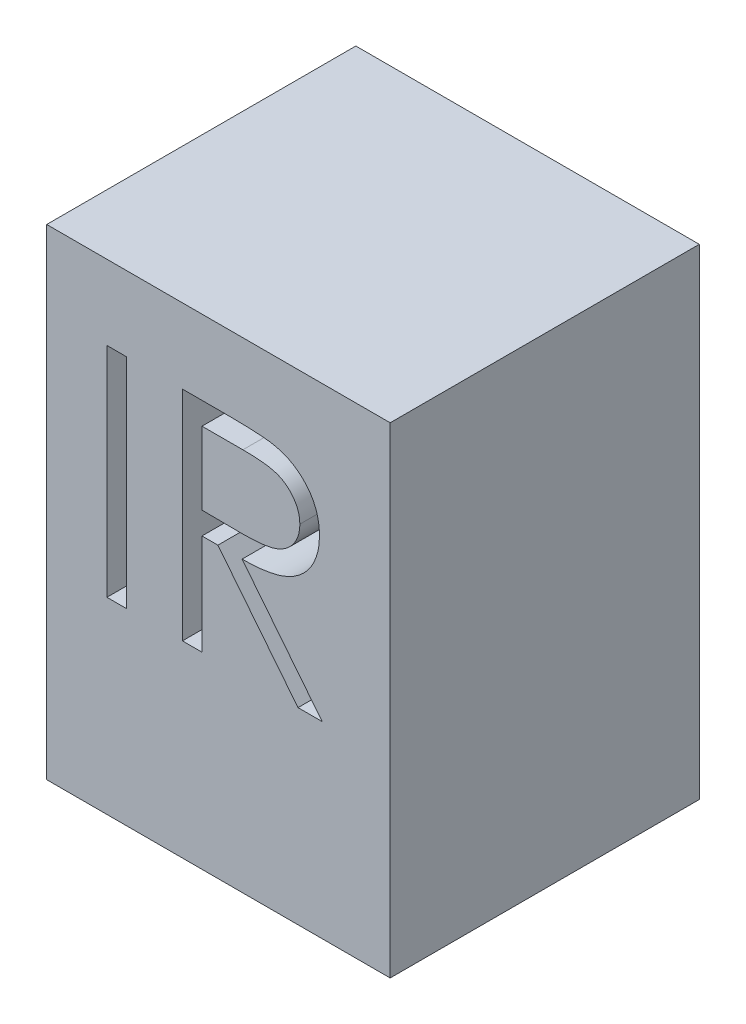
ISO-10303-21;
HEADER;
FILE_DESCRIPTION(('STEP AP214'),'2;1');
FILE_NAME('part.step','',(''),(''),'','','');
FILE_SCHEMA(('AUTOMOTIVE_DESIGN { 1 0 10303 214 1 1 1 1 }'));
ENDSEC;
DATA;
#1=APPLICATION_CONTEXT('core data for automotive mechanical design processes');
#2=APPLICATION_PROTOCOL_DEFINITION('international standard','automotive_design',2000,#1);
#3=PRODUCT_CONTEXT('',#1,'mechanical');
#4=PRODUCT('Part','Part','',(#3));
#5=PRODUCT_RELATED_PRODUCT_CATEGORY('part','',(#4));
#6=PRODUCT_DEFINITION_FORMATION('','',#4);
#7=PRODUCT_DEFINITION_CONTEXT('part definition',#1,'design');
#8=PRODUCT_DEFINITION('design','',#6,#7);
#9=PRODUCT_DEFINITION_SHAPE('','',#8);
#10=(LENGTH_UNIT() NAMED_UNIT(*) SI_UNIT(.MILLI.,.METRE.));
#11=(NAMED_UNIT(*) PLANE_ANGLE_UNIT() SI_UNIT($,.RADIAN.));
#12=(NAMED_UNIT(*) SI_UNIT($,.STERADIAN.) SOLID_ANGLE_UNIT());
#13=UNCERTAINTY_MEASURE_WITH_UNIT(LENGTH_MEASURE(1.E-05),#10,'distance_accuracy_value','');
#14=(GEOMETRIC_REPRESENTATION_CONTEXT(3) GLOBAL_UNCERTAINTY_ASSIGNED_CONTEXT((#13)) GLOBAL_UNIT_ASSIGNED_CONTEXT((#10,
#11,#12)) REPRESENTATION_CONTEXT('',''));
#15=CARTESIAN_POINT('',(0.,0.,0.));
#16=DIRECTION('',(0.,0.,1.));
#17=DIRECTION('',(1.,0.,0.));
#18=AXIS2_PLACEMENT_3D('',#15,#16,#17);
#19=CARTESIAN_POINT('',(0.,0.,4.5));
#20=DIRECTION('',(0.,0.,-1.));
#21=DIRECTION('',(-1.,0.,0.));
#22=AXIS2_PLACEMENT_3D('',#19,#20,#21);
#23=PLANE('',#22);
#24=DIRECTION('',(0.,1.,0.));
#25=VECTOR('',#24,1.);
#26=CARTESIAN_POINT('',(1.97557816004579,2.73785841834464,4.5));
#27=LINE('',#26,#25);
#28=CARTESIAN_POINT('',(1.97557816004579,2.73785841834464,4.5));
#29=VERTEX_POINT('',#28);
#30=CARTESIAN_POINT('',(1.97557816004579,5.91285841834464,4.5));
#31=VERTEX_POINT('',#30);
#32=EDGE_CURVE('E60',#29,#31,#27,.T.);
#33=ORIENTED_EDGE('',*,*,#32,.T.);
#34=DIRECTION('',(1.,0.,0.));
#35=VECTOR('',#34,1.);
#36=CARTESIAN_POINT('',(1.97557816004579,5.91285841834464,4.5));
#37=LINE('',#36,#35);
#38=CARTESIAN_POINT('',(2.61095977062271,5.91285841834464,4.5));
#39=VERTEX_POINT('',#38);
#40=EDGE_CURVE('E293',#31,#39,#37,.T.);
#41=ORIENTED_EDGE('',*,*,#40,.T.);
#42=CARTESIAN_POINT('',(2.61095977062271,5.91285841834464,4.5));
#43=CARTESIAN_POINT('',(2.6533606514886,5.91271727962692,4.5));
#44=CARTESIAN_POINT('',(2.73477503963111,5.91244627765452,4.5));
#45=CARTESIAN_POINT('',(2.85140936345735,5.91093519273071,4.5));
#46=CARTESIAN_POINT('',(2.95738823002181,5.90660417005252,4.5));
#47=CARTESIAN_POINT('',(3.05265622711664,5.90287709789828,4.5));
#48=CARTESIAN_POINT('',(3.13721160698801,5.89608083684085,4.5));
#49=CARTESIAN_POINT('',(3.21131364930936,5.8895851069536,4.5));
#50=CARTESIAN_POINT('',(3.27462106061403,5.8810818575327,4.5));
#51=CARTESIAN_POINT('',(3.31294408286709,5.87318479527102,4.5));
#52=CARTESIAN_POINT('',(3.33029570812271,5.86960921962669,4.5));
#53=B_SPLINE_CURVE_WITH_KNOTS('',3,(#42,#43,#44,#45,#46,#47,#48,#49,#50,#51,#52),.UNSPECIFIED.,
.F.,.F.,(4,1,1,1,1,1,1,1,4),(0.,0.1762577548178,0.338434413880475,0.484822050787836,
0.617157578266332,0.734698360612476,0.83738518383236,0.926372420929584,1.),.UNSPECIFIED.);
#54=CARTESIAN_POINT('',(3.33029570812271,5.86960921962669,4.5));
#55=VERTEX_POINT('',#54);
#56=EDGE_CURVE('E285',#39,#55,#53,.T.);
#57=ORIENTED_EDGE('',*,*,#56,.T.);
#58=CARTESIAN_POINT('',(3.33029570812271,5.86960921962669,4.5));
#59=CARTESIAN_POINT('',(3.35352457430399,5.8638699396165,4.5));
#60=CARTESIAN_POINT('',(3.39948677189621,5.85251381401798,4.5));
#61=CARTESIAN_POINT('',(3.4656629032324,5.82851117612796,4.5));
#62=CARTESIAN_POINT('',(3.52872232567433,5.80073480236127,4.5));
#63=CARTESIAN_POINT('',(3.58840309488046,5.76811057035844,4.5));
#64=CARTESIAN_POINT('',(3.64440627688891,5.73039630594122,4.5));
#65=CARTESIAN_POINT('',(3.69730931596693,5.68824308058933,4.5));
#66=CARTESIAN_POINT('',(3.74735227203305,5.64188154392612,4.5));
#67=CARTESIAN_POINT('',(3.79251132226808,5.5901427948487,4.5));
#68=CARTESIAN_POINT('',(3.83509174773386,5.53586253249614,4.5));
#69=CARTESIAN_POINT('',(3.87100428748795,5.47716698164735,4.5));
#70=CARTESIAN_POINT('',(3.90196187980764,5.41578831025056,4.5));
#71=CARTESIAN_POINT('',(3.9266094202292,5.35110229557238,4.5));
#72=CARTESIAN_POINT('',(3.94645586759413,5.28373625966843,4.5));
#73=CARTESIAN_POINT('',(3.96044967045207,5.2130799940659,4.5));
#74=CARTESIAN_POINT('',(3.96884181923144,5.13945539523978,4.5));
#75=CARTESIAN_POINT('',(3.96969621676928,5.0892378636931,4.5));
#76=CARTESIAN_POINT('',(3.97012944209707,5.06377488469079,4.5));
#77=B_SPLINE_CURVE_WITH_KNOTS('',3,(#58,#59,#60,#61,#62,#63,#64,#65,#66,#67,#68,#69,#70,#71,#72,
#73,#74,#75,#76),.UNSPECIFIED.,.F.,.F.,(4,1,1,1,1,1,1,1,1,1,1,1,1,1,1,1,4),(0.,
0.0642168426314305,0.127063765693129,0.188744538347829,0.249132102835041,0.309452532710628,
0.369826676247682,0.430650141838469,0.492351931879469,0.554072106262517,0.615689783744975,
0.676797702506538,0.738439048246941,0.801316910064893,0.865184511711541,0.931641324419075,1.),.UNSPECIFIED.);
#78=CARTESIAN_POINT('',(3.97012944209707,5.06377488469079,4.5));
#79=VERTEX_POINT('',#78);
#80=EDGE_CURVE('E277',#55,#79,#77,.T.);
#81=ORIENTED_EDGE('',*,*,#80,.T.);
#82=CARTESIAN_POINT('',(3.97012944209707,5.06377488469079,4.5));
#83=CARTESIAN_POINT('',(3.96879685095579,5.02147018265087,4.5));
#84=CARTESIAN_POINT('',(3.96619662048947,4.93892275178098,4.5));
#85=CARTESIAN_POINT('',(3.94195313357975,4.81912466650302,4.5));
#86=CARTESIAN_POINT('',(3.90224157639723,4.70737435965062,4.5));
#87=CARTESIAN_POINT('',(3.84751973565307,4.60381253811302,4.5));
#88=CARTESIAN_POINT('',(3.77783349697012,4.51045788125062,4.5));
#89=CARTESIAN_POINT('',(3.6940817221835,4.42846082536781,4.5));
#90=CARTESIAN_POINT('',(3.59621768890359,4.35984461894614,4.5));
#91=CARTESIAN_POINT('',(3.50511395230162,4.31226243182406,4.5));
#92=CARTESIAN_POINT('',(3.42463749971967,4.28178886471447,4.5));
#93=CARTESIAN_POINT('',(3.35838585169053,4.26034731060662,4.5));
#94=CARTESIAN_POINT('',(3.28611652210503,4.24378109924813,4.5));
#95=CARTESIAN_POINT('',(3.20852193999827,4.22894012257053,4.5));
#96=CARTESIAN_POINT('',(3.12527919537329,4.2177353712115,4.5));
#97=CARTESIAN_POINT('',(3.0365878024988,4.20952881765716,4.5));
#98=CARTESIAN_POINT('',(2.94238450780579,4.20439978776657,4.5));
#99=CARTESIAN_POINT('',(2.87766978060687,4.20363596904589,4.5));
#100=CARTESIAN_POINT('',(2.844378240174,4.20324303372926,4.5));
#101=B_SPLINE_CURVE_WITH_KNOTS('',3,(#82,#83,#84,#85,#86,#87,#88,#89,#90,#91,#92,#93,#94,#95,
#96,#97,#98,#99,#100),.UNSPECIFIED.,.F.,.F.,(4,1,1,1,1,1,1,1,1,1,1,1,1,1,1,1,4),(0.,
0.0787802355821392,0.153720644208585,0.226713530308781,0.299191166065937,0.371189996837669,
0.44300641435341,0.516689173294881,0.593217216623413,0.633872917807846,0.676989142289979,
0.722899506325827,0.771958610506144,0.824211323334836,0.879378650627202,0.937948119330418,1.),.UNSPECIFIED.);
#102=CARTESIAN_POINT('',(2.844378240174,4.20324303372926,4.5));
#103=VERTEX_POINT('',#102);
#104=EDGE_CURVE('E272',#79,#103,#101,.T.);
#105=ORIENTED_EDGE('',*,*,#104,.T.);
#106=DIRECTION('',(0.622788232243938,-0.782390450976027,0.));
#107=VECTOR('',#106,1.);
#108=CARTESIAN_POINT('',(2.844378240174,4.20324303372926,4.5));
#109=LINE('',#108,#107);
#110=CARTESIAN_POINT('',(4.0108345703022,2.73785841834464,4.5));
#111=VERTEX_POINT('',#110);
#112=EDGE_CURVE('E269',#103,#111,#109,.T.);
#113=ORIENTED_EDGE('',*,*,#112,.T.);
#114=DIRECTION('',(-1.,0.,0.));
#115=VECTOR('',#114,1.);
#116=CARTESIAN_POINT('',(4.0108345703022,2.73785841834464,4.5));
#117=LINE('',#116,#115);
#118=CARTESIAN_POINT('',(3.65848080427656,2.73785841834464,4.5));
#119=VERTEX_POINT('',#118);
#120=EDGE_CURVE('E266',#111,#119,#117,.T.);
#121=ORIENTED_EDGE('',*,*,#120,.T.);
#122=DIRECTION('',(-0.622788232243938,0.782390450976027,0.));
#123=VECTOR('',#122,1.);
#124=CARTESIAN_POINT('',(3.65848080427656,2.73785841834464,4.5));
#125=LINE('',#124,#123);
#126=CARTESIAN_POINT('',(2.49202447414836,4.20324303372926,4.5));
#127=VERTEX_POINT('',#126);
#128=EDGE_CURVE('E263',#119,#127,#125,.T.);
#129=ORIENTED_EDGE('',*,*,#128,.T.);
#130=DIRECTION('',(-1.,0.,0.));
#131=VECTOR('',#130,1.);
#132=CARTESIAN_POINT('',(2.49202447414836,4.20324303372926,4.5));
#133=LINE('',#132,#131);
#134=CARTESIAN_POINT('',(2.26051405748169,4.20324303372926,4.5));
#135=VERTEX_POINT('',#134);
#136=EDGE_CURVE('E260',#127,#135,#133,.T.);
#137=ORIENTED_EDGE('',*,*,#136,.T.);
#138=DIRECTION('',(0.,-1.,0.));
#139=VECTOR('',#138,1.);
#140=CARTESIAN_POINT('',(2.26051405748169,4.20324303372926,4.5));
#141=LINE('',#140,#139);
#142=CARTESIAN_POINT('',(2.26051405748169,2.73785841834464,4.5));
#143=VERTEX_POINT('',#142);
#144=EDGE_CURVE('E256',#135,#143,#141,.T.);
#145=ORIENTED_EDGE('',*,*,#144,.T.);
#146=DIRECTION('',(-1.,0.,0.));
#147=VECTOR('',#146,1.);
#148=CARTESIAN_POINT('',(2.26051405748169,2.73785841834464,4.5));
#149=LINE('',#148,#147);
#150=EDGE_CURVE('E253',#143,#29,#149,.T.);
#151=ORIENTED_EDGE('',*,*,#150,.T.);
#152=EDGE_LOOP('',(#33,#41,#57,#81,#105,#113,#121,#129,#137,#145,#151));
#153=FACE_BOUND('',#152,.T.);
#154=DIRECTION('',(0.,-1.,0.));
#155=VECTOR('',#154,1.);
#156=CARTESIAN_POINT('',(0.,0.,4.5));
#157=LINE('',#156,#155);
#158=CARTESIAN_POINT('',(0.,7.,4.5));
#159=VERTEX_POINT('',#158);
#160=CARTESIAN_POINT('',(0.,0.,4.5));
#161=VERTEX_POINT('',#160);
#162=EDGE_CURVE('E405',#159,#161,#157,.T.);
#163=ORIENTED_EDGE('',*,*,#162,.T.);
#164=DIRECTION('',(1.,0.,0.));
#165=VECTOR('',#164,1.);
#166=CARTESIAN_POINT('',(0.,0.,4.5));
#167=LINE('',#166,#165);
#168=CARTESIAN_POINT('',(5.,0.,4.5));
#169=VERTEX_POINT('',#168);
#170=EDGE_CURVE('E408',#161,#169,#167,.T.);
#171=ORIENTED_EDGE('',*,*,#170,.T.);
#172=DIRECTION('',(0.,1.,0.));
#173=VECTOR('',#172,1.);
#174=CARTESIAN_POINT('',(5.,0.,4.5));
#175=LINE('',#174,#173);
#176=CARTESIAN_POINT('',(5.,7.,4.5));
#177=VERTEX_POINT('',#176);
#178=EDGE_CURVE('E411',#169,#177,#175,.T.);
#179=ORIENTED_EDGE('',*,*,#178,.T.);
#180=DIRECTION('',(-1.,0.,0.));
#181=VECTOR('',#180,1.);
#182=CARTESIAN_POINT('',(0.,7.,4.5));
#183=LINE('',#182,#181);
#184=EDGE_CURVE('E413',#177,#159,#183,.T.);
#185=ORIENTED_EDGE('',*,*,#184,.T.);
#186=EDGE_LOOP('',(#163,#171,#179,#185));
#187=FACE_BOUND('',#186,.T.);
#188=DIRECTION('',(0.,1.,0.));
#189=VECTOR('',#188,1.);
#190=CARTESIAN_POINT('',(0.876539698507329,2.73785841834464,4.5));
#191=LINE('',#190,#189);
#192=CARTESIAN_POINT('',(0.876539698507329,2.73785841834464,4.5));
#193=VERTEX_POINT('',#192);
#194=CARTESIAN_POINT('',(0.876539698507329,5.91285841834464,4.5));
#195=VERTEX_POINT('',#194);
#196=EDGE_CURVE('E52',#193,#195,#191,.T.);
#197=ORIENTED_EDGE('',*,*,#196,.T.);
#198=DIRECTION('',(1.,0.,0.));
#199=VECTOR('',#198,1.);
#200=CARTESIAN_POINT('',(0.876539698507329,5.91285841834464,4.5));
#201=LINE('',#200,#199);
#202=CARTESIAN_POINT('',(1.16147559594323,5.91285841834464,4.5));
#203=VERTEX_POINT('',#202);
#204=EDGE_CURVE('E219',#195,#203,#201,.T.);
#205=ORIENTED_EDGE('',*,*,#204,.T.);
#206=DIRECTION('',(0.,-1.,0.));
#207=VECTOR('',#206,1.);
#208=CARTESIAN_POINT('',(1.16147559594323,5.91285841834464,4.5));
#209=LINE('',#208,#207);
#210=CARTESIAN_POINT('',(1.16147559594323,2.73785841834464,4.5));
#211=VERTEX_POINT('',#210);
#212=EDGE_CURVE('E540',#203,#211,#209,.T.);
#213=ORIENTED_EDGE('',*,*,#212,.T.);
#214=DIRECTION('',(-1.,0.,0.));
#215=VECTOR('',#214,1.);
#216=CARTESIAN_POINT('',(1.16147559594323,2.73785841834464,4.5));
#217=LINE('',#216,#215);
#218=EDGE_CURVE('E215',#211,#193,#217,.T.);
#219=ORIENTED_EDGE('',*,*,#218,.T.);
#220=EDGE_LOOP('',(#197,#205,#213,#219));
#221=FACE_BOUND('',#220,.T.);
#222=ADVANCED_FACE('F37',(#153,#187,#221),#23,.F.);
#223=CARTESIAN_POINT('',(0.,0.,4.5));
#224=DIRECTION('',(1.,0.,0.));
#225=DIRECTION('',(0.,0.,-1.));
#226=AXIS2_PLACEMENT_3D('',#223,#224,#225);
#227=PLANE('',#226);
#228=DIRECTION('',(0.,-1.,0.));
#229=VECTOR('',#228,1.);
#230=CARTESIAN_POINT('',(0.,0.,0.));
#231=LINE('',#230,#229);
#232=CARTESIAN_POINT('',(0.,7.,0.));
#233=VERTEX_POINT('',#232);
#234=CARTESIAN_POINT('',(0.,0.,0.));
#235=VERTEX_POINT('',#234);
#236=EDGE_CURVE('E220',#233,#235,#231,.T.);
#237=ORIENTED_EDGE('',*,*,#236,.T.);
#238=DIRECTION('',(0.,0.,-1.));
#239=VECTOR('',#238,1.);
#240=CARTESIAN_POINT('',(0.,0.,4.5));
#241=LINE('',#240,#239);
#242=EDGE_CURVE('E11',#161,#235,#241,.T.);
#243=ORIENTED_EDGE('',*,*,#242,.F.);
#244=ORIENTED_EDGE('',*,*,#162,.F.);
#245=DIRECTION('',(0.,0.,-1.));
#246=VECTOR('',#245,1.);
#247=CARTESIAN_POINT('',(0.,7.,4.5));
#248=LINE('',#247,#246);
#249=EDGE_CURVE('E414',#159,#233,#248,.T.);
#250=ORIENTED_EDGE('',*,*,#249,.T.);
#251=EDGE_LOOP('',(#237,#243,#244,#250));
#252=FACE_BOUND('',#251,.T.);
#253=ADVANCED_FACE('F39',(#252),#227,.F.);
#254=CARTESIAN_POINT('',(0.,0.,4.5));
#255=DIRECTION('',(0.,1.,0.));
#256=DIRECTION('',(0.,0.,1.));
#257=AXIS2_PLACEMENT_3D('',#254,#255,#256);
#258=PLANE('',#257);
#259=DIRECTION('',(1.,0.,0.));
#260=VECTOR('',#259,1.);
#261=CARTESIAN_POINT('',(0.,0.,0.));
#262=LINE('',#261,#260);
#263=CARTESIAN_POINT('',(5.,0.,0.));
#264=VERTEX_POINT('',#263);
#265=EDGE_CURVE('E224',#235,#264,#262,.T.);
#266=ORIENTED_EDGE('',*,*,#265,.T.);
#267=DIRECTION('',(0.,0.,-1.));
#268=VECTOR('',#267,1.);
#269=CARTESIAN_POINT('',(5.,0.,4.5));
#270=LINE('',#269,#268);
#271=EDGE_CURVE('E45',#169,#264,#270,.T.);
#272=ORIENTED_EDGE('',*,*,#271,.F.);
#273=ORIENTED_EDGE('',*,*,#170,.F.);
#274=ORIENTED_EDGE('',*,*,#242,.T.);
#275=EDGE_LOOP('',(#266,#272,#273,#274));
#276=FACE_BOUND('',#275,.T.);
#277=ADVANCED_FACE('F445',(#276),#258,.F.);
#278=CARTESIAN_POINT('',(5.,0.,4.5));
#279=DIRECTION('',(-1.,0.,0.));
#280=DIRECTION('',(0.,-1.,0.));
#281=AXIS2_PLACEMENT_3D('',#278,#279,#280);
#282=PLANE('',#281);
#283=DIRECTION('',(0.,1.,0.));
#284=VECTOR('',#283,1.);
#285=CARTESIAN_POINT('',(5.,0.,0.));
#286=LINE('',#285,#284);
#287=CARTESIAN_POINT('',(5.,7.,0.));
#288=VERTEX_POINT('',#287);
#289=EDGE_CURVE('E417',#264,#288,#286,.T.);
#290=ORIENTED_EDGE('',*,*,#289,.T.);
#291=DIRECTION('',(0.,0.,-1.));
#292=VECTOR('',#291,1.);
#293=CARTESIAN_POINT('',(5.,7.,4.5));
#294=LINE('',#293,#292);
#295=EDGE_CURVE('E422',#177,#288,#294,.T.);
#296=ORIENTED_EDGE('',*,*,#295,.F.);
#297=ORIENTED_EDGE('',*,*,#178,.F.);
#298=ORIENTED_EDGE('',*,*,#271,.T.);
#299=EDGE_LOOP('',(#290,#296,#297,#298));
#300=FACE_BOUND('',#299,.T.);
#301=ADVANCED_FACE('F429',(#300),#282,.F.);
#302=CARTESIAN_POINT('',(0.,7.,4.5));
#303=DIRECTION('',(0.,-1.,0.));
#304=DIRECTION('',(0.,0.,-1.));
#305=AXIS2_PLACEMENT_3D('',#302,#303,#304);
#306=PLANE('',#305);
#307=DIRECTION('',(-1.,0.,0.));
#308=VECTOR('',#307,1.);
#309=CARTESIAN_POINT('',(0.,7.,0.));
#310=LINE('',#309,#308);
#311=EDGE_CURVE('E409',#288,#233,#310,.T.);
#312=ORIENTED_EDGE('',*,*,#311,.T.);
#313=ORIENTED_EDGE('',*,*,#249,.F.);
#314=ORIENTED_EDGE('',*,*,#184,.F.);
#315=ORIENTED_EDGE('',*,*,#295,.T.);
#316=EDGE_LOOP('',(#312,#313,#314,#315));
#317=FACE_BOUND('',#316,.T.);
#318=ADVANCED_FACE('F438',(#317),#306,.F.);
#319=CARTESIAN_POINT('',(0.,0.,0.));
#320=DIRECTION('',(0.,0.,-1.));
#321=DIRECTION('',(-1.,0.,0.));
#322=AXIS2_PLACEMENT_3D('',#319,#320,#321);
#323=PLANE('',#322);
#324=ORIENTED_EDGE('',*,*,#236,.F.);
#325=ORIENTED_EDGE('',*,*,#311,.F.);
#326=ORIENTED_EDGE('',*,*,#289,.F.);
#327=ORIENTED_EDGE('',*,*,#265,.F.);
#328=EDGE_LOOP('',(#324,#325,#326,#327));
#329=FACE_BOUND('',#328,.T.);
#330=ADVANCED_FACE('F435',(#329),#323,.T.);
#331=CARTESIAN_POINT('',(1.97557816004579,2.73785841834464,3.23));
#332=DIRECTION('',(1.,0.,0.));
#333=DIRECTION('',(0.,0.,-1.));
#334=AXIS2_PLACEMENT_3D('',#331,#332,#333);
#335=PLANE('',#334);
#336=ORIENTED_EDGE('',*,*,#32,.F.);
#337=DIRECTION('',(0.,0.,1.));
#338=VECTOR('',#337,1.);
#339=CARTESIAN_POINT('',(1.97557816004579,2.73785841834464,3.23));
#340=LINE('',#339,#338);
#341=CARTESIAN_POINT('',(1.97557816004579,2.73785841834464,3.23));
#342=VERTEX_POINT('',#341);
#343=EDGE_CURVE('E250',#342,#29,#340,.T.);
#344=ORIENTED_EDGE('',*,*,#343,.F.);
#345=DIRECTION('',(0.,1.,0.));
#346=VECTOR('',#345,1.);
#347=CARTESIAN_POINT('',(1.97557816004579,2.73785841834464,3.23));
#348=LINE('',#347,#346);
#349=CARTESIAN_POINT('',(1.97557816004579,5.91285841834464,3.23));
#350=VERTEX_POINT('',#349);
#351=EDGE_CURVE('E257',#342,#350,#348,.T.);
#352=ORIENTED_EDGE('',*,*,#351,.T.);
#353=DIRECTION('',(0.,0.,1.));
#354=VECTOR('',#353,1.);
#355=CARTESIAN_POINT('',(1.97557816004579,5.91285841834464,3.23));
#356=LINE('',#355,#354);
#357=EDGE_CURVE('E230',#350,#31,#356,.T.);
#358=ORIENTED_EDGE('',*,*,#357,.T.);
#359=EDGE_LOOP('',(#336,#344,#352,#358));
#360=FACE_BOUND('',#359,.T.);
#361=ADVANCED_FACE('F520',(#360),#335,.T.);
#362=CARTESIAN_POINT('',(1.97557816004579,5.91285841834464,3.23));
#363=DIRECTION('',(0.,-1.,0.));
#364=DIRECTION('',(0.,0.,-1.));
#365=AXIS2_PLACEMENT_3D('',#362,#363,#364);
#366=PLANE('',#365);
#367=ORIENTED_EDGE('',*,*,#40,.F.);
#368=ORIENTED_EDGE('',*,*,#357,.F.);
#369=DIRECTION('',(1.,0.,0.));
#370=VECTOR('',#369,1.);
#371=CARTESIAN_POINT('',(1.97557816004579,5.91285841834464,3.23));
#372=LINE('',#371,#370);
#373=CARTESIAN_POINT('',(2.61095977062271,5.91285841834464,3.23));
#374=VERTEX_POINT('',#373);
#375=EDGE_CURVE('E505',#350,#374,#372,.T.);
#376=ORIENTED_EDGE('',*,*,#375,.T.);
#377=DIRECTION('',(0.,0.,1.));
#378=VECTOR('',#377,1.);
#379=CARTESIAN_POINT('',(2.61095977062271,5.91285841834464,3.23));
#380=LINE('',#379,#378);
#381=EDGE_CURVE('E232',#374,#39,#380,.T.);
#382=ORIENTED_EDGE('',*,*,#381,.T.);
#383=EDGE_LOOP('',(#367,#368,#376,#382));
#384=FACE_BOUND('',#383,.T.);
#385=ADVANCED_FACE('F516',(#384),#366,.T.);
#386=CARTESIAN_POINT('',(2.61095977062271,5.91285841834464,3.23));
#387=CARTESIAN_POINT('',(2.6533606514886,5.91271727962692,3.23));
#388=CARTESIAN_POINT('',(2.73477503963111,5.91244627765452,3.23));
#389=CARTESIAN_POINT('',(2.85140936345735,5.91093519273071,3.23));
#390=CARTESIAN_POINT('',(2.95738823002181,5.90660417005252,3.23));
#391=CARTESIAN_POINT('',(3.05265622711664,5.90287709789828,3.23));
#392=CARTESIAN_POINT('',(3.13721160698801,5.89608083684085,3.23));
#393=CARTESIAN_POINT('',(3.21131364930936,5.8895851069536,3.23));
#394=CARTESIAN_POINT('',(3.27462106061403,5.8810818575327,3.23));
#395=CARTESIAN_POINT('',(3.31294408286709,5.87318479527102,3.23));
#396=CARTESIAN_POINT('',(3.33029570812271,5.86960921962669,3.23));
#397=B_SPLINE_CURVE_WITH_KNOTS('',3,(#386,#387,#388,#389,#390,#391,#392,#393,#394,#395,#396),
.UNSPECIFIED.,.F.,.F.,(4,1,1,1,1,1,1,1,4),(0.,0.1762577548178,0.338434413880475,
0.484822050787836,0.617157578266332,0.734698360612476,0.83738518383236,0.926372420929584,1.),.UNSPECIFIED.);
#398=DIRECTION('',(0.,0.,1.));
#399=VECTOR('',#398,1.);
#400=SURFACE_OF_LINEAR_EXTRUSION('',#397,#399);
#401=ORIENTED_EDGE('',*,*,#56,.F.);
#402=ORIENTED_EDGE('',*,*,#381,.F.);
#403=CARTESIAN_POINT('',(3.33029570812271,5.86960921962669,3.23));
#404=VERTEX_POINT('',#403);
#405=EDGE_CURVE('E506',#374,#404,#397,.T.);
#406=ORIENTED_EDGE('',*,*,#405,.T.);
#407=DIRECTION('',(0.,0.,1.));
#408=VECTOR('',#407,1.);
#409=CARTESIAN_POINT('',(3.33029570812271,5.86960921962669,3.23));
#410=LINE('',#409,#408);
#411=EDGE_CURVE('E234',#404,#55,#410,.T.);
#412=ORIENTED_EDGE('',*,*,#411,.T.);
#413=EDGE_LOOP('',(#401,#402,#406,#412));
#414=FACE_BOUND('',#413,.T.);
#415=ADVANCED_FACE('F513',(#414),#400,.T.);
#416=CARTESIAN_POINT('',(3.33029570812271,5.86960921962669,3.23));
#417=CARTESIAN_POINT('',(3.35352457430399,5.8638699396165,3.23));
#418=CARTESIAN_POINT('',(3.39948677189621,5.85251381401798,3.23));
#419=CARTESIAN_POINT('',(3.4656629032324,5.82851117612796,3.23));
#420=CARTESIAN_POINT('',(3.52872232567433,5.80073480236127,3.23));
#421=CARTESIAN_POINT('',(3.58840309488046,5.76811057035844,3.23));
#422=CARTESIAN_POINT('',(3.64440627688891,5.73039630594122,3.23));
#423=CARTESIAN_POINT('',(3.69730931596693,5.68824308058933,3.23));
#424=CARTESIAN_POINT('',(3.74735227203305,5.64188154392612,3.23));
#425=CARTESIAN_POINT('',(3.79251132226808,5.5901427948487,3.23));
#426=CARTESIAN_POINT('',(3.83509174773386,5.53586253249614,3.23));
#427=CARTESIAN_POINT('',(3.87100428748795,5.47716698164735,3.23));
#428=CARTESIAN_POINT('',(3.90196187980764,5.41578831025056,3.23));
#429=CARTESIAN_POINT('',(3.9266094202292,5.35110229557238,3.23));
#430=CARTESIAN_POINT('',(3.94645586759413,5.28373625966843,3.23));
#431=CARTESIAN_POINT('',(3.96044967045207,5.2130799940659,3.23));
#432=CARTESIAN_POINT('',(3.96884181923144,5.13945539523978,3.23));
#433=CARTESIAN_POINT('',(3.96969621676928,5.0892378636931,3.23));
#434=CARTESIAN_POINT('',(3.97012944209707,5.06377488469079,3.23));
#435=B_SPLINE_CURVE_WITH_KNOTS('',3,(#416,#417,#418,#419,#420,#421,#422,#423,#424,#425,#426,
#427,#428,#429,#430,#431,#432,#433,#434),.UNSPECIFIED.,.F.,.F.,(4,1,1,1,1,1,1,1,1,1,1,1,1,1,1,1,
4),(0.,0.0642168426314305,0.127063765693129,0.188744538347829,0.249132102835041,
0.309452532710628,0.369826676247682,0.430650141838469,0.492351931879469,0.554072106262517,
0.615689783744975,0.676797702506538,0.738439048246941,0.801316910064893,0.865184511711541,
0.931641324419075,1.),.UNSPECIFIED.);
#436=DIRECTION('',(0.,0.,1.));
#437=VECTOR('',#436,1.);
#438=SURFACE_OF_LINEAR_EXTRUSION('',#435,#437);
#439=ORIENTED_EDGE('',*,*,#80,.F.);
#440=ORIENTED_EDGE('',*,*,#411,.F.);
#441=CARTESIAN_POINT('',(3.97012944209707,5.06377488469079,3.23));
#442=VERTEX_POINT('',#441);
#443=EDGE_CURVE('E317',#404,#442,#435,.T.);
#444=ORIENTED_EDGE('',*,*,#443,.T.);
#445=DIRECTION('',(0.,0.,1.));
#446=VECTOR('',#445,1.);
#447=CARTESIAN_POINT('',(3.97012944209707,5.06377488469079,3.23));
#448=LINE('',#447,#446);
#449=EDGE_CURVE('E236',#442,#79,#448,.T.);
#450=ORIENTED_EDGE('',*,*,#449,.T.);
#451=EDGE_LOOP('',(#439,#440,#444,#450));
#452=FACE_BOUND('',#451,.T.);
#453=ADVANCED_FACE('F331',(#452),#438,.T.);
#454=CARTESIAN_POINT('',(3.97012944209707,5.06377488469079,3.23));
#455=CARTESIAN_POINT('',(3.96879685095579,5.02147018265087,3.23));
#456=CARTESIAN_POINT('',(3.96619662048947,4.93892275178098,3.23));
#457=CARTESIAN_POINT('',(3.94195313357975,4.81912466650302,3.23));
#458=CARTESIAN_POINT('',(3.90224157639723,4.70737435965062,3.23));
#459=CARTESIAN_POINT('',(3.84751973565307,4.60381253811302,3.23));
#460=CARTESIAN_POINT('',(3.77783349697012,4.51045788125062,3.23));
#461=CARTESIAN_POINT('',(3.6940817221835,4.42846082536781,3.23));
#462=CARTESIAN_POINT('',(3.59621768890359,4.35984461894614,3.23));
#463=CARTESIAN_POINT('',(3.50511395230162,4.31226243182406,3.23));
#464=CARTESIAN_POINT('',(3.42463749971967,4.28178886471447,3.23));
#465=CARTESIAN_POINT('',(3.35838585169053,4.26034731060662,3.23));
#466=CARTESIAN_POINT('',(3.28611652210503,4.24378109924813,3.23));
#467=CARTESIAN_POINT('',(3.20852193999827,4.22894012257053,3.23));
#468=CARTESIAN_POINT('',(3.12527919537329,4.2177353712115,3.23));
#469=CARTESIAN_POINT('',(3.0365878024988,4.20952881765716,3.23));
#470=CARTESIAN_POINT('',(2.94238450780579,4.20439978776657,3.23));
#471=CARTESIAN_POINT('',(2.87766978060687,4.20363596904589,3.23));
#472=CARTESIAN_POINT('',(2.844378240174,4.20324303372926,3.23));
#473=B_SPLINE_CURVE_WITH_KNOTS('',3,(#454,#455,#456,#457,#458,#459,#460,#461,#462,#463,#464,
#465,#466,#467,#468,#469,#470,#471,#472),.UNSPECIFIED.,.F.,.F.,(4,1,1,1,1,1,1,1,1,1,1,1,1,1,1,1,
4),(0.,0.0787802355821392,0.153720644208585,0.226713530308781,0.299191166065937,
0.371189996837669,0.44300641435341,0.516689173294881,0.593217216623413,0.633872917807846,
0.676989142289979,0.722899506325827,0.771958610506144,0.824211323334836,0.879378650627202,
0.937948119330418,1.),.UNSPECIFIED.);
#474=DIRECTION('',(0.,0.,1.));
#475=VECTOR('',#474,1.);
#476=SURFACE_OF_LINEAR_EXTRUSION('',#473,#475);
#477=ORIENTED_EDGE('',*,*,#104,.F.);
#478=ORIENTED_EDGE('',*,*,#449,.F.);
#479=CARTESIAN_POINT('',(2.844378240174,4.20324303372926,3.23));
#480=VERTEX_POINT('',#479);
#481=EDGE_CURVE('E312',#442,#480,#473,.T.);
#482=ORIENTED_EDGE('',*,*,#481,.T.);
#483=DIRECTION('',(0.,0.,1.));
#484=VECTOR('',#483,1.);
#485=CARTESIAN_POINT('',(2.844378240174,4.20324303372926,3.23));
#486=LINE('',#485,#484);
#487=EDGE_CURVE('E238',#480,#103,#486,.T.);
#488=ORIENTED_EDGE('',*,*,#487,.T.);
#489=EDGE_LOOP('',(#477,#478,#482,#488));
#490=FACE_BOUND('',#489,.T.);
#491=ADVANCED_FACE('F326',(#490),#476,.T.);
#492=CARTESIAN_POINT('',(2.844378240174,4.20324303372926,3.23));
#493=DIRECTION('',(-0.782390450976027,-0.622788232243938,0.));
#494=DIRECTION('',(0.622788232243938,-0.782390450976027,0.));
#495=AXIS2_PLACEMENT_3D('',#492,#493,#494);
#496=PLANE('',#495);
#497=ORIENTED_EDGE('',*,*,#112,.F.);
#498=ORIENTED_EDGE('',*,*,#487,.F.);
#499=DIRECTION('',(0.622788232243938,-0.782390450976027,0.));
#500=VECTOR('',#499,1.);
#501=CARTESIAN_POINT('',(2.844378240174,4.20324303372926,3.23));
#502=LINE('',#501,#500);
#503=CARTESIAN_POINT('',(4.0108345703022,2.73785841834464,3.23));
#504=VERTEX_POINT('',#503);
#505=EDGE_CURVE('E310',#480,#504,#502,.T.);
#506=ORIENTED_EDGE('',*,*,#505,.T.);
#507=DIRECTION('',(0.,0.,1.));
#508=VECTOR('',#507,1.);
#509=CARTESIAN_POINT('',(4.0108345703022,2.73785841834464,3.23));
#510=LINE('',#509,#508);
#511=EDGE_CURVE('E240',#504,#111,#510,.T.);
#512=ORIENTED_EDGE('',*,*,#511,.T.);
#513=EDGE_LOOP('',(#497,#498,#506,#512));
#514=FACE_BOUND('',#513,.T.);
#515=ADVANCED_FACE('F330',(#514),#496,.T.);
#516=CARTESIAN_POINT('',(4.0108345703022,2.73785841834464,3.23));
#517=DIRECTION('',(0.,1.,0.));
#518=DIRECTION('',(0.,0.,1.));
#519=AXIS2_PLACEMENT_3D('',#516,#517,#518);
#520=PLANE('',#519);
#521=ORIENTED_EDGE('',*,*,#120,.F.);
#522=ORIENTED_EDGE('',*,*,#511,.F.);
#523=DIRECTION('',(-1.,0.,0.));
#524=VECTOR('',#523,1.);
#525=CARTESIAN_POINT('',(4.0108345703022,2.73785841834464,3.23));
#526=LINE('',#525,#524);
#527=CARTESIAN_POINT('',(3.65848080427656,2.73785841834464,3.23));
#528=VERTEX_POINT('',#527);
#529=EDGE_CURVE('E308',#504,#528,#526,.T.);
#530=ORIENTED_EDGE('',*,*,#529,.T.);
#531=DIRECTION('',(0.,0.,1.));
#532=VECTOR('',#531,1.);
#533=CARTESIAN_POINT('',(3.65848080427656,2.73785841834464,3.23));
#534=LINE('',#533,#532);
#535=EDGE_CURVE('E242',#528,#119,#534,.T.);
#536=ORIENTED_EDGE('',*,*,#535,.T.);
#537=EDGE_LOOP('',(#521,#522,#530,#536));
#538=FACE_BOUND('',#537,.T.);
#539=ADVANCED_FACE('F336',(#538),#520,.T.);
#540=CARTESIAN_POINT('',(3.65848080427656,2.73785841834464,3.23));
#541=DIRECTION('',(0.782390450976027,0.622788232243938,0.));
#542=DIRECTION('',(-0.622788232243938,0.782390450976027,0.));
#543=AXIS2_PLACEMENT_3D('',#540,#541,#542);
#544=PLANE('',#543);
#545=ORIENTED_EDGE('',*,*,#128,.F.);
#546=ORIENTED_EDGE('',*,*,#535,.F.);
#547=DIRECTION('',(-0.622788232243938,0.782390450976027,0.));
#548=VECTOR('',#547,1.);
#549=CARTESIAN_POINT('',(3.65848080427656,2.73785841834464,3.23));
#550=LINE('',#549,#548);
#551=CARTESIAN_POINT('',(2.49202447414836,4.20324303372926,3.23));
#552=VERTEX_POINT('',#551);
#553=EDGE_CURVE('E306',#528,#552,#550,.T.);
#554=ORIENTED_EDGE('',*,*,#553,.T.);
#555=DIRECTION('',(0.,0.,1.));
#556=VECTOR('',#555,1.);
#557=CARTESIAN_POINT('',(2.49202447414836,4.20324303372926,3.23));
#558=LINE('',#557,#556);
#559=EDGE_CURVE('E244',#552,#127,#558,.T.);
#560=ORIENTED_EDGE('',*,*,#559,.T.);
#561=EDGE_LOOP('',(#545,#546,#554,#560));
#562=FACE_BOUND('',#561,.T.);
#563=ADVANCED_FACE('F340',(#562),#544,.T.);
#564=CARTESIAN_POINT('',(2.49202447414836,4.20324303372926,3.23));
#565=DIRECTION('',(0.,1.,0.));
#566=DIRECTION('',(0.,0.,1.));
#567=AXIS2_PLACEMENT_3D('',#564,#565,#566);
#568=PLANE('',#567);
#569=ORIENTED_EDGE('',*,*,#136,.F.);
#570=ORIENTED_EDGE('',*,*,#559,.F.);
#571=DIRECTION('',(-1.,0.,0.));
#572=VECTOR('',#571,1.);
#573=CARTESIAN_POINT('',(2.49202447414836,4.20324303372926,3.23));
#574=LINE('',#573,#572);
#575=CARTESIAN_POINT('',(2.26051405748169,4.20324303372926,3.23));
#576=VERTEX_POINT('',#575);
#577=EDGE_CURVE('E304',#552,#576,#574,.T.);
#578=ORIENTED_EDGE('',*,*,#577,.T.);
#579=DIRECTION('',(0.,0.,1.));
#580=VECTOR('',#579,1.);
#581=CARTESIAN_POINT('',(2.26051405748169,4.20324303372926,3.23));
#582=LINE('',#581,#580);
#583=EDGE_CURVE('E246',#576,#135,#582,.T.);
#584=ORIENTED_EDGE('',*,*,#583,.T.);
#585=EDGE_LOOP('',(#569,#570,#578,#584));
#586=FACE_BOUND('',#585,.T.);
#587=ADVANCED_FACE('F344',(#586),#568,.T.);
#588=CARTESIAN_POINT('',(2.26051405748169,4.20324303372926,3.23));
#589=DIRECTION('',(-1.,0.,0.));
#590=DIRECTION('',(0.,0.,1.));
#591=AXIS2_PLACEMENT_3D('',#588,#589,#590);
#592=PLANE('',#591);
#593=ORIENTED_EDGE('',*,*,#144,.F.);
#594=ORIENTED_EDGE('',*,*,#583,.F.);
#595=DIRECTION('',(0.,-1.,0.));
#596=VECTOR('',#595,1.);
#597=CARTESIAN_POINT('',(2.26051405748169,4.20324303372926,3.23));
#598=LINE('',#597,#596);
#599=CARTESIAN_POINT('',(2.26051405748169,2.73785841834464,3.23));
#600=VERTEX_POINT('',#599);
#601=EDGE_CURVE('E302',#576,#600,#598,.T.);
#602=ORIENTED_EDGE('',*,*,#601,.T.);
#603=DIRECTION('',(0.,0.,1.));
#604=VECTOR('',#603,1.);
#605=CARTESIAN_POINT('',(2.26051405748169,2.73785841834464,3.23));
#606=LINE('',#605,#604);
#607=EDGE_CURVE('E248',#600,#143,#606,.T.);
#608=ORIENTED_EDGE('',*,*,#607,.T.);
#609=EDGE_LOOP('',(#593,#594,#602,#608));
#610=FACE_BOUND('',#609,.T.);
#611=ADVANCED_FACE('F348',(#610),#592,.T.);
#612=CARTESIAN_POINT('',(2.26051405748169,2.73785841834464,3.23));
#613=DIRECTION('',(0.,1.,0.));
#614=DIRECTION('',(0.,0.,1.));
#615=AXIS2_PLACEMENT_3D('',#612,#613,#614);
#616=PLANE('',#615);
#617=ORIENTED_EDGE('',*,*,#150,.F.);
#618=ORIENTED_EDGE('',*,*,#607,.F.);
#619=DIRECTION('',(-1.,0.,0.));
#620=VECTOR('',#619,1.);
#621=CARTESIAN_POINT('',(2.26051405748169,2.73785841834464,3.23));
#622=LINE('',#621,#620);
#623=EDGE_CURVE('E252',#600,#342,#622,.T.);
#624=ORIENTED_EDGE('',*,*,#623,.T.);
#625=ORIENTED_EDGE('',*,*,#343,.T.);
#626=EDGE_LOOP('',(#617,#618,#624,#625));
#627=FACE_BOUND('',#626,.T.);
#628=ADVANCED_FACE('F352',(#627),#616,.T.);
#629=CARTESIAN_POINT('',(2.97171556223197,5.90606089579454,3.23));
#630=DIRECTION('',(0.,0.,1.));
#631=DIRECTION('',(1.,0.,0.));
#632=AXIS2_PLACEMENT_3D('',#629,#630,#631);
#633=PLANE('',#632);
#634=CARTESIAN_POINT('',(3.68519354466118,5.064410902319,3.23));
#635=CARTESIAN_POINT('',(3.68410304910233,5.08994386563093,3.23));
#636=CARTESIAN_POINT('',(3.68194208481758,5.14054088214649,3.23));
#637=CARTESIAN_POINT('',(3.66429927336834,5.2146144579074,3.23));
#638=CARTESIAN_POINT('',(3.63446390599499,5.28452519124032,3.23));
#639=CARTESIAN_POINT('',(3.59425730444894,5.34998868833993,3.23));
#640=CARTESIAN_POINT('',(3.54527235673294,5.40941174872213,3.23));
#641=CARTESIAN_POINT('',(3.4878340552171,5.46025452328145,3.23));
#642=CARTESIAN_POINT('',(3.42351291390239,5.50220939481087,3.23));
#643=CARTESIAN_POINT('',(3.36339546968318,5.52901943998949,3.23));
#644=CARTESIAN_POINT('',(3.30966157692222,5.54545673543401,3.23));
#645=CARTESIAN_POINT('',(3.26300752817083,5.55702386260546,3.23));
#646=CARTESIAN_POINT('',(3.21029211623967,5.56631705942047,3.23));
#647=CARTESIAN_POINT('',(3.15125937878456,5.57376294321442,3.23));
#648=CARTESIAN_POINT('',(3.08616132800113,5.58016278549725,3.23));
#649=CARTESIAN_POINT('',(3.01466880879669,5.58447332756569,3.23));
#650=CARTESIAN_POINT('',(2.9372561581311,5.58702590429043,3.23));
#651=CARTESIAN_POINT('',(2.88360144197887,5.58715207777493,3.23));
#652=CARTESIAN_POINT('',(2.85582655748169,5.58721739270361,3.23));
#653=B_SPLINE_CURVE_WITH_KNOTS('',3,(#634,#635,#636,#637,#638,#639,#640,#641,#642,#643,#644,
#645,#646,#647,#648,#649,#650,#651,#652),.UNSPECIFIED.,.F.,.F.,(4,1,1,1,1,1,1,1,1,1,1,1,1,1,1,1,
4),(0.,0.0688142958243092,0.136364824552215,0.204019353511247,0.273063738624611,
0.34291331956149,0.410965444138958,0.479168766513447,0.549308006509782,0.58765157641765,
0.630646668762791,0.678878785696649,0.731934299229583,0.791111422948047,0.855283189513077,
0.925085938677385,1.),.UNSPECIFIED.);
#654=CARTESIAN_POINT('',(3.68519354466118,5.064410902319,3.23));
#655=VERTEX_POINT('',#654);
#656=CARTESIAN_POINT('',(2.85582655748169,5.58721739270361,3.23));
#657=VERTEX_POINT('',#656);
#658=EDGE_CURVE('E388',#655,#657,#653,.T.);
#659=ORIENTED_EDGE('',*,*,#658,.F.);
#660=CARTESIAN_POINT('',(2.84183416966118,4.52443193597284,3.23));
#661=CARTESIAN_POINT('',(2.86897591925457,4.52441992843657,3.23));
#662=CARTESIAN_POINT('',(2.92158436035575,4.52439665441134,3.23));
#663=CARTESIAN_POINT('',(2.99769424914893,4.52801958000372,3.23));
#664=CARTESIAN_POINT('',(3.06856035046916,4.53214101869556,3.23));
#665=CARTESIAN_POINT('',(3.1339116042165,4.53844506786103,3.23));
#666=CARTESIAN_POINT('',(3.19377720469077,4.54656950435511,3.23));
#667=CARTESIAN_POINT('',(3.24812722954179,4.55673221148587,3.23));
#668=CARTESIAN_POINT('',(3.29705039804812,4.56857229688697,3.23));
#669=CARTESIAN_POINT('',(3.354108357903,4.58689805744316,3.23));
#670=CARTESIAN_POINT('',(3.41782292563392,4.61593208829808,3.23));
#671=CARTESIAN_POINT('',(3.48706646423669,4.65817364782813,3.23));
#672=CARTESIAN_POINT('',(3.54603287062467,4.71130420593006,3.23));
#673=CARTESIAN_POINT('',(3.59585121714416,4.77205869818984,3.23));
#674=CARTESIAN_POINT('',(3.63588291569678,4.83885729534973,3.23));
#675=CARTESIAN_POINT('',(3.66410599355739,4.91089928742442,3.23));
#676=CARTESIAN_POINT('',(3.68201520906521,4.98636595133132,3.23));
#677=CARTESIAN_POINT('',(3.68412753243719,5.03823466344762,3.23));
#678=CARTESIAN_POINT('',(3.68519354466118,5.064410902319,3.23));
#679=B_SPLINE_CURVE_WITH_KNOTS('',3,(#660,#661,#662,#663,#664,#665,#666,#667,#668,#669,#670,
#671,#672,#673,#674,#675,#676,#677,#678),.UNSPECIFIED.,.F.,.F.,(4,1,1,1,1,1,1,1,1,1,1,1,1,1,1,1,
4),(0.,0.0716681496796051,0.138913286274205,0.201184570026559,0.259124428290545,
0.312255041426235,0.36068150962311,0.405086143328645,0.445101658590711,0.51877778048826,
0.589461579033198,0.658462241985717,0.727283218368367,0.79632248690472,0.863174893207881,
0.930949380987856,1.),.UNSPECIFIED.);
#680=CARTESIAN_POINT('',(2.84183416966118,4.52443193597284,3.23));
#681=VERTEX_POINT('',#680);
#682=EDGE_CURVE('E381',#681,#655,#679,.T.);
#683=ORIENTED_EDGE('',*,*,#682,.F.);
#684=DIRECTION('',(0.999970673881285,-0.00765841872775729,0.));
#685=VECTOR('',#684,1.);
#686=CARTESIAN_POINT('',(2.26051405748169,4.52888405937028,3.23));
#687=LINE('',#686,#685);
#688=CARTESIAN_POINT('',(2.26051405748169,4.52888405937028,3.23));
#689=VERTEX_POINT('',#688);
#690=EDGE_CURVE('E387',#689,#681,#687,.T.);
#691=ORIENTED_EDGE('',*,*,#690,.F.);
#692=DIRECTION('',(0.,-1.,0.));
#693=VECTOR('',#692,1.);
#694=CARTESIAN_POINT('',(2.26051405748169,5.58721739270361,3.23));
#695=LINE('',#694,#693);
#696=CARTESIAN_POINT('',(2.26051405748169,5.58721739270361,3.23));
#697=VERTEX_POINT('',#696);
#698=EDGE_CURVE('E398',#697,#689,#695,.T.);
#699=ORIENTED_EDGE('',*,*,#698,.F.);
#700=DIRECTION('',(-1.,0.,0.));
#701=VECTOR('',#700,1.);
#702=CARTESIAN_POINT('',(2.85582655748169,5.58721739270361,3.23));
#703=LINE('',#702,#701);
#704=EDGE_CURVE('E401',#657,#697,#703,.T.);
#705=ORIENTED_EDGE('',*,*,#704,.F.);
#706=EDGE_LOOP('',(#659,#683,#691,#699,#705));
#707=FACE_BOUND('',#706,.T.);
#708=ORIENTED_EDGE('',*,*,#351,.F.);
#709=ORIENTED_EDGE('',*,*,#623,.F.);
#710=ORIENTED_EDGE('',*,*,#601,.F.);
#711=ORIENTED_EDGE('',*,*,#577,.F.);
#712=ORIENTED_EDGE('',*,*,#553,.F.);
#713=ORIENTED_EDGE('',*,*,#529,.F.);
#714=ORIENTED_EDGE('',*,*,#505,.F.);
#715=ORIENTED_EDGE('',*,*,#481,.F.);
#716=ORIENTED_EDGE('',*,*,#443,.F.);
#717=ORIENTED_EDGE('',*,*,#405,.F.);
#718=ORIENTED_EDGE('',*,*,#375,.F.);
#719=EDGE_LOOP('',(#708,#709,#710,#711,#712,#713,#714,#715,#716,#717,#718));
#720=FACE_BOUND('',#719,.T.);
#721=ADVANCED_FACE('F356',(#707,#720),#633,.T.);
#722=CARTESIAN_POINT('',(2.85582655748169,5.58721739270361,3.23));
#723=DIRECTION('',(0.,1.,0.));
#724=DIRECTION('',(0.,0.,1.));
#725=AXIS2_PLACEMENT_3D('',#722,#723,#724);
#726=PLANE('',#725);
#727=DIRECTION('',(-1.,0.,0.));
#728=VECTOR('',#727,1.);
#729=CARTESIAN_POINT('',(2.85582655748169,5.58721739270361,4.5));
#730=LINE('',#729,#728);
#731=CARTESIAN_POINT('',(2.85582655748169,5.58721739270361,4.5));
#732=VERTEX_POINT('',#731);
#733=CARTESIAN_POINT('',(2.26051405748169,5.58721739270361,4.5));
#734=VERTEX_POINT('',#733);
#735=EDGE_CURVE('E469',#732,#734,#730,.T.);
#736=ORIENTED_EDGE('',*,*,#735,.F.);
#737=DIRECTION('',(0.,0.,1.));
#738=VECTOR('',#737,1.);
#739=CARTESIAN_POINT('',(2.85582655748169,5.58721739270361,3.23));
#740=LINE('',#739,#738);
#741=EDGE_CURVE('E300',#657,#732,#740,.T.);
#742=ORIENTED_EDGE('',*,*,#741,.F.);
#743=ORIENTED_EDGE('',*,*,#704,.T.);
#744=DIRECTION('',(0.,0.,1.));
#745=VECTOR('',#744,1.);
#746=CARTESIAN_POINT('',(2.26051405748169,5.58721739270361,3.23));
#747=LINE('',#746,#745);
#748=EDGE_CURVE('E501',#697,#734,#747,.T.);
#749=ORIENTED_EDGE('',*,*,#748,.T.);
#750=EDGE_LOOP('',(#736,#742,#743,#749));
#751=FACE_BOUND('',#750,.T.);
#752=ADVANCED_FACE('F360',(#751),#726,.T.);
#753=DIRECTION('',(0.,0.,1.));
#754=VECTOR('',#753,1.);
#755=SURFACE_OF_LINEAR_EXTRUSION('',#653,#754);
#756=CARTESIAN_POINT('',(3.68519354466118,5.064410902319,4.5));
#757=CARTESIAN_POINT('',(3.68410304910233,5.08994386563093,4.5));
#758=CARTESIAN_POINT('',(3.68194208481758,5.14054088214649,4.5));
#759=CARTESIAN_POINT('',(3.66429927336834,5.2146144579074,4.5));
#760=CARTESIAN_POINT('',(3.63446390599499,5.28452519124032,4.5));
#761=CARTESIAN_POINT('',(3.59425730444894,5.34998868833993,4.5));
#762=CARTESIAN_POINT('',(3.54527235673294,5.40941174872213,4.5));
#763=CARTESIAN_POINT('',(3.4878340552171,5.46025452328145,4.5));
#764=CARTESIAN_POINT('',(3.42351291390239,5.50220939481087,4.5));
#765=CARTESIAN_POINT('',(3.36339546968318,5.52901943998949,4.5));
#766=CARTESIAN_POINT('',(3.30966157692222,5.54545673543401,4.5));
#767=CARTESIAN_POINT('',(3.26300752817083,5.55702386260546,4.5));
#768=CARTESIAN_POINT('',(3.21029211623967,5.56631705942047,4.5));
#769=CARTESIAN_POINT('',(3.15125937878456,5.57376294321442,4.5));
#770=CARTESIAN_POINT('',(3.08616132800113,5.58016278549725,4.5));
#771=CARTESIAN_POINT('',(3.01466880879669,5.58447332756569,4.5));
#772=CARTESIAN_POINT('',(2.9372561581311,5.58702590429043,4.5));
#773=CARTESIAN_POINT('',(2.88360144197887,5.58715207777493,4.5));
#774=CARTESIAN_POINT('',(2.85582655748169,5.58721739270361,4.5));
#775=B_SPLINE_CURVE_WITH_KNOTS('',3,(#756,#757,#758,#759,#760,#761,#762,#763,#764,#765,#766,
#767,#768,#769,#770,#771,#772,#773,#774),.UNSPECIFIED.,.F.,.F.,(4,1,1,1,1,1,1,1,1,1,1,1,1,1,1,1,
4),(0.,0.0688142958243092,0.136364824552215,0.204019353511247,0.273063738624611,
0.34291331956149,0.410965444138958,0.479168766513447,0.549308006509782,0.58765157641765,
0.630646668762791,0.678878785696649,0.731934299229583,0.791111422948047,0.855283189513077,
0.925085938677385,1.),.UNSPECIFIED.);
#776=CARTESIAN_POINT('',(3.68519354466118,5.064410902319,4.5));
#777=VERTEX_POINT('',#776);
#778=EDGE_CURVE('E404',#777,#732,#775,.T.);
#779=ORIENTED_EDGE('',*,*,#778,.F.);
#780=DIRECTION('',(0.,0.,1.));
#781=VECTOR('',#780,1.);
#782=CARTESIAN_POINT('',(3.68519354466118,5.064410902319,3.23));
#783=LINE('',#782,#781);
#784=EDGE_CURVE('E494',#655,#777,#783,.T.);
#785=ORIENTED_EDGE('',*,*,#784,.F.);
#786=ORIENTED_EDGE('',*,*,#658,.T.);
#787=ORIENTED_EDGE('',*,*,#741,.T.);
#788=EDGE_LOOP('',(#779,#785,#786,#787));
#789=FACE_BOUND('',#788,.T.);
#790=ADVANCED_FACE('F364',(#789),#755,.T.);
#791=DIRECTION('',(0.,0.,1.));
#792=VECTOR('',#791,1.);
#793=SURFACE_OF_LINEAR_EXTRUSION('',#679,#792);
#794=CARTESIAN_POINT('',(2.84183416966118,4.52443193597284,4.5));
#795=CARTESIAN_POINT('',(2.86897591925457,4.52441992843657,4.5));
#796=CARTESIAN_POINT('',(2.92158436035575,4.52439665441134,4.5));
#797=CARTESIAN_POINT('',(2.99769424914893,4.52801958000372,4.5));
#798=CARTESIAN_POINT('',(3.06856035046916,4.53214101869556,4.5));
#799=CARTESIAN_POINT('',(3.1339116042165,4.53844506786103,4.5));
#800=CARTESIAN_POINT('',(3.19377720469077,4.54656950435511,4.5));
#801=CARTESIAN_POINT('',(3.24812722954179,4.55673221148587,4.5));
#802=CARTESIAN_POINT('',(3.29705039804812,4.56857229688697,4.5));
#803=CARTESIAN_POINT('',(3.354108357903,4.58689805744316,4.5));
#804=CARTESIAN_POINT('',(3.41782292563392,4.61593208829808,4.5));
#805=CARTESIAN_POINT('',(3.48706646423669,4.65817364782813,4.5));
#806=CARTESIAN_POINT('',(3.54603287062467,4.71130420593006,4.5));
#807=CARTESIAN_POINT('',(3.59585121714416,4.77205869818984,4.5));
#808=CARTESIAN_POINT('',(3.63588291569678,4.83885729534973,4.5));
#809=CARTESIAN_POINT('',(3.66410599355739,4.91089928742442,4.5));
#810=CARTESIAN_POINT('',(3.68201520906521,4.98636595133132,4.5));
#811=CARTESIAN_POINT('',(3.68412753243719,5.03823466344762,4.5));
#812=CARTESIAN_POINT('',(3.68519354466118,5.064410902319,4.5));
#813=B_SPLINE_CURVE_WITH_KNOTS('',3,(#794,#795,#796,#797,#798,#799,#800,#801,#802,#803,#804,
#805,#806,#807,#808,#809,#810,#811,#812),.UNSPECIFIED.,.F.,.F.,(4,1,1,1,1,1,1,1,1,1,1,1,1,1,1,1,
4),(0.,0.0716681496796051,0.138913286274205,0.201184570026559,0.259124428290545,
0.312255041426235,0.36068150962311,0.405086143328645,0.445101658590711,0.51877778048826,
0.589461579033198,0.658462241985717,0.727283218368367,0.79632248690472,0.863174893207881,
0.930949380987856,1.),.UNSPECIFIED.);
#814=CARTESIAN_POINT('',(2.84183416966118,4.52443193597284,4.5));
#815=VERTEX_POINT('',#814);
#816=EDGE_CURVE('E480',#815,#777,#813,.T.);
#817=ORIENTED_EDGE('',*,*,#816,.F.);
#818=DIRECTION('',(0.,0.,1.));
#819=VECTOR('',#818,1.);
#820=CARTESIAN_POINT('',(2.84183416966118,4.52443193597284,3.23));
#821=LINE('',#820,#819);
#822=EDGE_CURVE('E496',#681,#815,#821,.T.);
#823=ORIENTED_EDGE('',*,*,#822,.F.);
#824=ORIENTED_EDGE('',*,*,#682,.T.);
#825=ORIENTED_EDGE('',*,*,#784,.T.);
#826=EDGE_LOOP('',(#817,#823,#824,#825));
#827=FACE_BOUND('',#826,.T.);
#828=ADVANCED_FACE('F373',(#827),#793,.T.);
#829=CARTESIAN_POINT('',(2.26051405748169,4.52888405937028,3.23));
#830=DIRECTION('',(-0.00765841872775729,-0.999970673881285,0.));
#831=DIRECTION('',(0.999970673881285,-0.00765841872775729,0.));
#832=AXIS2_PLACEMENT_3D('',#829,#830,#831);
#833=PLANE('',#832);
#834=DIRECTION('',(0.999970673881285,-0.00765841872775729,0.));
#835=VECTOR('',#834,1.);
#836=CARTESIAN_POINT('',(2.26051405748169,4.52888405937028,4.5));
#837=LINE('',#836,#835);
#838=CARTESIAN_POINT('',(2.26051405748169,4.52888405937028,4.5));
#839=VERTEX_POINT('',#838);
#840=EDGE_CURVE('E476',#839,#815,#837,.T.);
#841=ORIENTED_EDGE('',*,*,#840,.F.);
#842=DIRECTION('',(0.,0.,1.));
#843=VECTOR('',#842,1.);
#844=CARTESIAN_POINT('',(2.26051405748169,4.52888405937028,3.23));
#845=LINE('',#844,#843);
#846=EDGE_CURVE('E498',#689,#839,#845,.T.);
#847=ORIENTED_EDGE('',*,*,#846,.F.);
#848=ORIENTED_EDGE('',*,*,#690,.T.);
#849=ORIENTED_EDGE('',*,*,#822,.T.);
#850=EDGE_LOOP('',(#841,#847,#848,#849));
#851=FACE_BOUND('',#850,.T.);
#852=ADVANCED_FACE('F369',(#851),#833,.T.);
#853=CARTESIAN_POINT('',(2.26051405748169,5.58721739270361,3.23));
#854=DIRECTION('',(-1.,0.,0.));
#855=DIRECTION('',(0.,0.,1.));
#856=AXIS2_PLACEMENT_3D('',#853,#854,#855);
#857=PLANE('',#856);
#858=DIRECTION('',(0.,-1.,0.));
#859=VECTOR('',#858,1.);
#860=CARTESIAN_POINT('',(2.26051405748169,5.58721739270361,4.5));
#861=LINE('',#860,#859);
#862=EDGE_CURVE('E472',#734,#839,#861,.T.);
#863=ORIENTED_EDGE('',*,*,#862,.F.);
#864=ORIENTED_EDGE('',*,*,#748,.F.);
#865=ORIENTED_EDGE('',*,*,#698,.T.);
#866=ORIENTED_EDGE('',*,*,#846,.T.);
#867=EDGE_LOOP('',(#863,#864,#865,#866));
#868=FACE_BOUND('',#867,.T.);
#869=ADVANCED_FACE('F366',(#868),#857,.T.);
#870=CARTESIAN_POINT('',(0.876539698507329,2.73785841834464,3.23));
#871=DIRECTION('',(1.,0.,0.));
#872=DIRECTION('',(0.,0.,-1.));
#873=AXIS2_PLACEMENT_3D('',#870,#871,#872);
#874=PLANE('',#873);
#875=ORIENTED_EDGE('',*,*,#196,.F.);
#876=DIRECTION('',(0.,0.,1.));
#877=VECTOR('',#876,1.);
#878=CARTESIAN_POINT('',(0.876539698507329,2.73785841834464,3.23));
#879=LINE('',#878,#877);
#880=CARTESIAN_POINT('',(0.876539698507329,2.73785841834464,3.23));
#881=VERTEX_POINT('',#880);
#882=EDGE_CURVE('E214',#881,#193,#879,.T.);
#883=ORIENTED_EDGE('',*,*,#882,.F.);
#884=DIRECTION('',(0.,1.,0.));
#885=VECTOR('',#884,1.);
#886=CARTESIAN_POINT('',(0.876539698507329,2.73785841834464,3.23));
#887=LINE('',#886,#885);
#888=CARTESIAN_POINT('',(0.876539698507329,5.91285841834464,3.23));
#889=VERTEX_POINT('',#888);
#890=EDGE_CURVE('E206',#881,#889,#887,.T.);
#891=ORIENTED_EDGE('',*,*,#890,.T.);
#892=DIRECTION('',(0.,0.,1.));
#893=VECTOR('',#892,1.);
#894=CARTESIAN_POINT('',(0.876539698507329,5.91285841834464,3.23));
#895=LINE('',#894,#893);
#896=EDGE_CURVE('E213',#889,#195,#895,.T.);
#897=ORIENTED_EDGE('',*,*,#896,.T.);
#898=EDGE_LOOP('',(#875,#883,#891,#897));
#899=FACE_BOUND('',#898,.T.);
#900=ADVANCED_FACE('F212',(#899),#874,.T.);
#901=CARTESIAN_POINT('',(0.876539698507329,5.91285841834464,3.23));
#902=DIRECTION('',(0.,-1.,0.));
#903=DIRECTION('',(0.,0.,-1.));
#904=AXIS2_PLACEMENT_3D('',#901,#902,#903);
#905=PLANE('',#904);
#906=ORIENTED_EDGE('',*,*,#204,.F.);
#907=ORIENTED_EDGE('',*,*,#896,.F.);
#908=DIRECTION('',(1.,0.,0.));
#909=VECTOR('',#908,1.);
#910=CARTESIAN_POINT('',(0.876539698507329,5.91285841834464,3.23));
#911=LINE('',#910,#909);
#912=CARTESIAN_POINT('',(1.16147559594323,5.91285841834464,3.23));
#913=VERTEX_POINT('',#912);
#914=EDGE_CURVE('E202',#889,#913,#911,.T.);
#915=ORIENTED_EDGE('',*,*,#914,.T.);
#916=DIRECTION('',(0.,0.,1.));
#917=VECTOR('',#916,1.);
#918=CARTESIAN_POINT('',(1.16147559594323,5.91285841834464,3.23));
#919=LINE('',#918,#917);
#920=EDGE_CURVE('E221',#913,#203,#919,.T.);
#921=ORIENTED_EDGE('',*,*,#920,.T.);
#922=EDGE_LOOP('',(#906,#907,#915,#921));
#923=FACE_BOUND('',#922,.T.);
#924=ADVANCED_FACE('F217',(#923),#905,.T.);
#925=CARTESIAN_POINT('',(1.16147559594323,5.91285841834464,3.23));
#926=DIRECTION('',(-1.,0.,0.));
#927=DIRECTION('',(0.,0.,1.));
#928=AXIS2_PLACEMENT_3D('',#925,#926,#927);
#929=PLANE('',#928);
#930=ORIENTED_EDGE('',*,*,#212,.F.);
#931=ORIENTED_EDGE('',*,*,#920,.F.);
#932=DIRECTION('',(0.,-1.,0.));
#933=VECTOR('',#932,1.);
#934=CARTESIAN_POINT('',(1.16147559594323,5.91285841834464,3.23));
#935=LINE('',#934,#933);
#936=CARTESIAN_POINT('',(1.16147559594323,2.73785841834464,3.23));
#937=VERTEX_POINT('',#936);
#938=EDGE_CURVE('E207',#913,#937,#935,.T.);
#939=ORIENTED_EDGE('',*,*,#938,.T.);
#940=DIRECTION('',(0.,0.,1.));
#941=VECTOR('',#940,1.);
#942=CARTESIAN_POINT('',(1.16147559594323,2.73785841834464,3.23));
#943=LINE('',#942,#941);
#944=EDGE_CURVE('E226',#937,#211,#943,.T.);
#945=ORIENTED_EDGE('',*,*,#944,.T.);
#946=EDGE_LOOP('',(#930,#931,#939,#945));
#947=FACE_BOUND('',#946,.T.);
#948=ADVANCED_FACE('F528',(#947),#929,.T.);
#949=CARTESIAN_POINT('',(1.16147559594323,2.73785841834464,3.23));
#950=DIRECTION('',(0.,1.,0.));
#951=DIRECTION('',(0.,0.,1.));
#952=AXIS2_PLACEMENT_3D('',#949,#950,#951);
#953=PLANE('',#952);
#954=ORIENTED_EDGE('',*,*,#218,.F.);
#955=ORIENTED_EDGE('',*,*,#944,.F.);
#956=DIRECTION('',(-1.,0.,0.));
#957=VECTOR('',#956,1.);
#958=CARTESIAN_POINT('',(1.16147559594323,2.73785841834464,3.23));
#959=LINE('',#958,#957);
#960=EDGE_CURVE('E546',#937,#881,#959,.T.);
#961=ORIENTED_EDGE('',*,*,#960,.T.);
#962=ORIENTED_EDGE('',*,*,#882,.T.);
#963=EDGE_LOOP('',(#954,#955,#961,#962));
#964=FACE_BOUND('',#963,.T.);
#965=ADVANCED_FACE('F463',(#964),#953,.T.);
#966=CARTESIAN_POINT('',(0.,0.,3.23));
#967=DIRECTION('',(0.,0.,-1.));
#968=DIRECTION('',(-1.,0.,0.));
#969=AXIS2_PLACEMENT_3D('',#966,#967,#968);
#970=PLANE('',#969);
#971=ORIENTED_EDGE('',*,*,#890,.F.);
#972=ORIENTED_EDGE('',*,*,#960,.F.);
#973=ORIENTED_EDGE('',*,*,#938,.F.);
#974=ORIENTED_EDGE('',*,*,#914,.F.);
#975=EDGE_LOOP('',(#971,#972,#973,#974));
#976=FACE_BOUND('',#975,.T.);
#977=ADVANCED_FACE('F204',(#976),#970,.F.);
#978=ORIENTED_EDGE('',*,*,#735,.T.);
#979=ORIENTED_EDGE('',*,*,#862,.T.);
#980=ORIENTED_EDGE('',*,*,#840,.T.);
#981=ORIENTED_EDGE('',*,*,#816,.T.);
#982=ORIENTED_EDGE('',*,*,#778,.T.);
#983=EDGE_LOOP('',(#978,#979,#980,#981,#982));
#984=FACE_BOUND('',#983,.T.);
#985=ADVANCED_FACE('F454',(#984),#23,.F.);
#986=CLOSED_SHELL('',(#222,#253,#277,#301,#318,#330,#361,#385,#415,#453,#491,#515,#539,#563,
#587,#611,#628,#721,#752,#790,#828,#852,#869,#900,#924,#948,#965,#977,#985));
#987=MANIFOLD_SOLID_BREP('B2',#986);
#988=ADVANCED_BREP_SHAPE_REPRESENTATION('',(#18,#987),#14);
#989=SHAPE_DEFINITION_REPRESENTATION(#9,#988);
ENDSEC;
END-ISO-10303-21;
